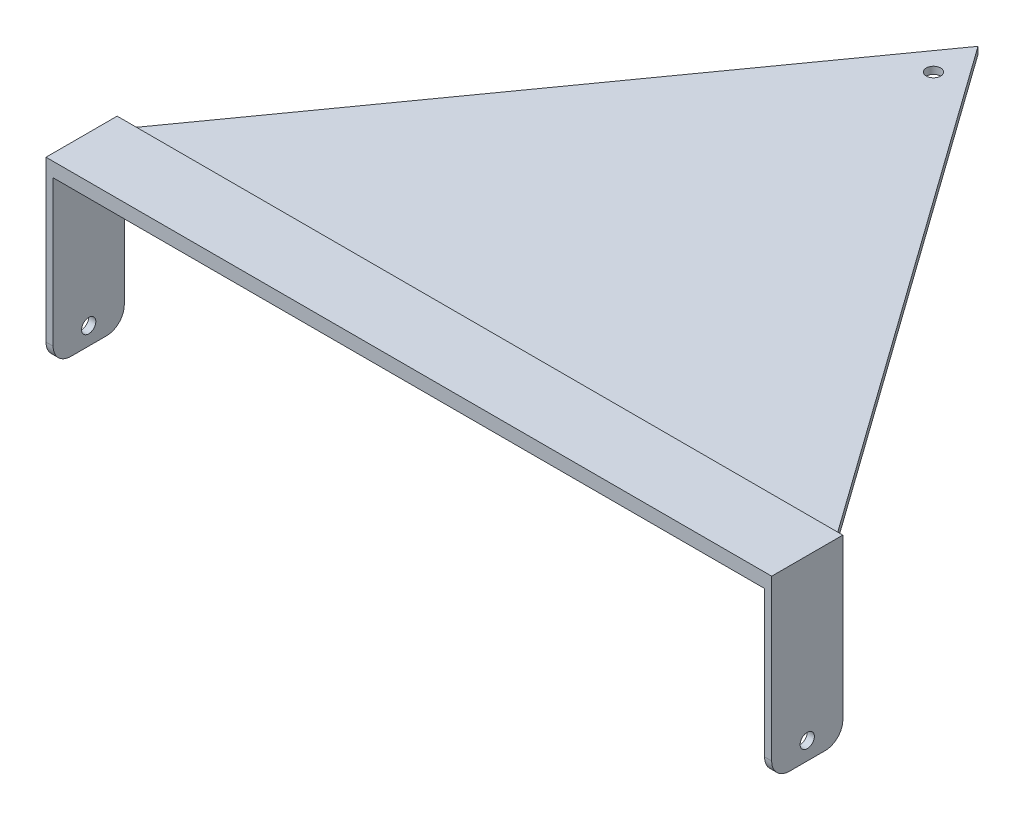
ISO-10303-21;
HEADER;
FILE_DESCRIPTION(('STEP AP214'),'2;1');
FILE_NAME('part.step','',(''),(''),'','','');
FILE_SCHEMA(('AUTOMOTIVE_DESIGN { 1 0 10303 214 1 1 1 1 }'));
ENDSEC;
DATA;
#1=APPLICATION_CONTEXT('core data for automotive mechanical design processes');
#2=APPLICATION_PROTOCOL_DEFINITION('international standard','automotive_design',2000,#1);
#3=PRODUCT_CONTEXT('',#1,'mechanical');
#4=PRODUCT('Part','Part','',(#3));
#5=PRODUCT_RELATED_PRODUCT_CATEGORY('part','',(#4));
#6=PRODUCT_DEFINITION_FORMATION('','',#4);
#7=PRODUCT_DEFINITION_CONTEXT('part definition',#1,'design');
#8=PRODUCT_DEFINITION('design','',#6,#7);
#9=PRODUCT_DEFINITION_SHAPE('','',#8);
#10=(LENGTH_UNIT() NAMED_UNIT(*) SI_UNIT(.MILLI.,.METRE.));
#11=(NAMED_UNIT(*) PLANE_ANGLE_UNIT() SI_UNIT($,.RADIAN.));
#12=(NAMED_UNIT(*) SI_UNIT($,.STERADIAN.) SOLID_ANGLE_UNIT());
#13=UNCERTAINTY_MEASURE_WITH_UNIT(LENGTH_MEASURE(1.E-05),#10,'distance_accuracy_value','');
#14=(GEOMETRIC_REPRESENTATION_CONTEXT(3) GLOBAL_UNCERTAINTY_ASSIGNED_CONTEXT((#13)) GLOBAL_UNIT_ASSIGNED_CONTEXT((#10,
#11,#12)) REPRESENTATION_CONTEXT('',''));
#15=CARTESIAN_POINT('',(0.,0.,0.));
#16=DIRECTION('',(0.,0.,1.));
#17=DIRECTION('',(1.,0.,0.));
#18=AXIS2_PLACEMENT_3D('',#15,#16,#17);
#19=CARTESIAN_POINT('',(0.,2.,0.));
#20=DIRECTION('',(0.,1.,0.));
#21=DIRECTION('',(0.,0.,1.));
#22=AXIS2_PLACEMENT_3D('',#19,#20,#21);
#23=PLANE('',#22);
#24=CARTESIAN_POINT('',(100.,2.,-137.477270848675));
#25=DIRECTION('',(0.,1.,0.));
#26=DIRECTION('',(0.,0.,1.));
#27=AXIS2_PLACEMENT_3D('',#24,#25,#26);
#28=CIRCLE('',#27,2.);
#29=CARTESIAN_POINT('',(100.,2.,-135.477270848675));
#30=VERTEX_POINT('',#29);
#31=EDGE_CURVE('E218',#30,#30,#28,.T.);
#32=ORIENTED_EDGE('',*,*,#31,.F.);
#33=EDGE_LOOP('',(#32));
#34=FACE_BOUND('',#33,.T.);
#35=DIRECTION('',(-0.581238193719096,0.,0.813733471206735));
#36=VECTOR('',#35,1.);
#37=CARTESIAN_POINT('',(0.,2.,-10.));
#38=LINE('',#37,#36);
#39=CARTESIAN_POINT('',(100.,2.,-150.));
#40=VERTEX_POINT('',#39);
#41=CARTESIAN_POINT('',(0.,2.,-10.));
#42=VERTEX_POINT('',#41);
#43=EDGE_CURVE('E229',#40,#42,#38,.T.);
#44=ORIENTED_EDGE('',*,*,#43,.T.);
#45=DIRECTION('',(1.,0.,0.));
#46=VECTOR('',#45,1.);
#47=CARTESIAN_POINT('',(0.,2.,-10.));
#48=LINE('',#47,#46);
#49=CARTESIAN_POINT('',(200.,2.,-10.));
#50=VERTEX_POINT('',#49);
#51=EDGE_CURVE('E205',#42,#50,#48,.T.);
#52=ORIENTED_EDGE('',*,*,#51,.T.);
#53=DIRECTION('',(-0.581238193719096,0.,-0.813733471206735));
#54=VECTOR('',#53,1.);
#55=CARTESIAN_POINT('',(200.,2.,-10.));
#56=LINE('',#55,#54);
#57=EDGE_CURVE('E226',#50,#40,#56,.T.);
#58=ORIENTED_EDGE('',*,*,#57,.T.);
#59=EDGE_LOOP('',(#44,#52,#58));
#60=FACE_BOUND('',#59,.T.);
#61=ADVANCED_FACE('F39',(#34,#60),#23,.T.);
#62=CARTESIAN_POINT('',(0.,0.,0.));
#63=DIRECTION('',(0.,1.,0.));
#64=DIRECTION('',(0.,0.,1.));
#65=AXIS2_PLACEMENT_3D('',#62,#63,#64);
#66=PLANE('',#65);
#67=DIRECTION('',(0.,0.,1.));
#68=VECTOR('',#67,1.);
#69=CARTESIAN_POINT('',(0.,0.,10.));
#70=LINE('',#69,#68);
#71=CARTESIAN_POINT('',(0.,0.,-10.));
#72=VERTEX_POINT('',#71);
#73=CARTESIAN_POINT('',(0.,0.,10.));
#74=VERTEX_POINT('',#73);
#75=EDGE_CURVE('E222',#72,#74,#70,.T.);
#76=ORIENTED_EDGE('',*,*,#75,.F.);
#77=DIRECTION('',(-0.581238193719096,0.,0.813733471206735));
#78=VECTOR('',#77,1.);
#79=CARTESIAN_POINT('',(0.,0.,-10.));
#80=LINE('',#79,#78);
#81=CARTESIAN_POINT('',(100.,0.,-150.));
#82=VERTEX_POINT('',#81);
#83=EDGE_CURVE('E230',#82,#72,#80,.T.);
#84=ORIENTED_EDGE('',*,*,#83,.F.);
#85=DIRECTION('',(-0.581238193719096,0.,-0.813733471206735));
#86=VECTOR('',#85,1.);
#87=CARTESIAN_POINT('',(200.,0.,-10.));
#88=LINE('',#87,#86);
#89=CARTESIAN_POINT('',(200.,0.,-10.));
#90=VERTEX_POINT('',#89);
#91=EDGE_CURVE('E246',#90,#82,#88,.T.);
#92=ORIENTED_EDGE('',*,*,#91,.F.);
#93=DIRECTION('',(0.,0.,-1.));
#94=VECTOR('',#93,1.);
#95=CARTESIAN_POINT('',(200.,0.,0.));
#96=LINE('',#95,#94);
#97=CARTESIAN_POINT('',(200.,0.,10.));
#98=VERTEX_POINT('',#97);
#99=EDGE_CURVE('E242',#98,#90,#96,.T.);
#100=ORIENTED_EDGE('',*,*,#99,.F.);
#101=DIRECTION('',(1.,0.,0.));
#102=VECTOR('',#101,1.);
#103=CARTESIAN_POINT('',(200.,0.,10.));
#104=LINE('',#103,#102);
#105=EDGE_CURVE('E238',#74,#98,#104,.T.);
#106=ORIENTED_EDGE('',*,*,#105,.F.);
#107=EDGE_LOOP('',(#76,#84,#92,#100,#106));
#108=FACE_BOUND('',#107,.T.);
#109=CARTESIAN_POINT('',(100.,0.,-137.477270848675));
#110=DIRECTION('',(0.,1.,0.));
#111=DIRECTION('',(0.,0.,1.));
#112=AXIS2_PLACEMENT_3D('',#109,#110,#111);
#113=CIRCLE('',#112,2.);
#114=CARTESIAN_POINT('',(100.,0.,-135.477270848675));
#115=VERTEX_POINT('',#114);
#116=EDGE_CURVE('E165',#115,#115,#113,.T.);
#117=ORIENTED_EDGE('',*,*,#116,.T.);
#118=EDGE_LOOP('',(#117));
#119=FACE_BOUND('',#118,.T.);
#120=ADVANCED_FACE('F329',(#108,#119),#66,.F.);
#121=CARTESIAN_POINT('',(200.,2.,10.));
#122=DIRECTION('',(0.,0.,-1.));
#123=DIRECTION('',(-1.,0.,0.));
#124=AXIS2_PLACEMENT_3D('',#121,#122,#123);
#125=PLANE('',#124);
#126=DIRECTION('',(0.,1.,0.));
#127=VECTOR('',#126,1.);
#128=CARTESIAN_POINT('',(200.,-46.,9.99999999999999));
#129=LINE('',#128,#127);
#130=CARTESIAN_POINT('',(200.,-41.,9.99999999999999));
#131=VERTEX_POINT('',#130);
#132=EDGE_CURVE('E155',#131,#98,#129,.T.);
#133=ORIENTED_EDGE('',*,*,#132,.F.);
#134=DIRECTION('',(1.,0.,0.));
#135=VECTOR('',#134,1.);
#136=CARTESIAN_POINT('',(200.,-41.,10.));
#137=LINE('',#136,#135);
#138=CARTESIAN_POINT('',(202.,-41.,9.99999999999999));
#139=VERTEX_POINT('',#138);
#140=EDGE_CURVE('E150',#131,#139,#137,.T.);
#141=ORIENTED_EDGE('',*,*,#140,.T.);
#142=DIRECTION('',(0.,1.,0.));
#143=VECTOR('',#142,1.);
#144=CARTESIAN_POINT('',(202.,-46.,9.99999999999999));
#145=LINE('',#144,#143);
#146=CARTESIAN_POINT('',(202.,4.,9.99999999999999));
#147=VERTEX_POINT('',#146);
#148=EDGE_CURVE('E142',#139,#147,#145,.T.);
#149=ORIENTED_EDGE('',*,*,#148,.T.);
#150=DIRECTION('',(1.,0.,0.));
#151=VECTOR('',#150,1.);
#152=CARTESIAN_POINT('',(0.,4.,10.));
#153=LINE('',#152,#151);
#154=CARTESIAN_POINT('',(-2.,4.,10.));
#155=VERTEX_POINT('',#154);
#156=EDGE_CURVE('E147',#155,#147,#153,.T.);
#157=ORIENTED_EDGE('',*,*,#156,.F.);
#158=DIRECTION('',(0.,1.,0.));
#159=VECTOR('',#158,1.);
#160=CARTESIAN_POINT('',(-2.,-46.,10.));
#161=LINE('',#160,#159);
#162=CARTESIAN_POINT('',(-2.,-41.,10.));
#163=VERTEX_POINT('',#162);
#164=EDGE_CURVE('E206',#163,#155,#161,.T.);
#165=ORIENTED_EDGE('',*,*,#164,.F.);
#166=DIRECTION('',(1.,0.,0.));
#167=VECTOR('',#166,1.);
#168=CARTESIAN_POINT('',(0.,-41.,10.));
#169=LINE('',#168,#167);
#170=CARTESIAN_POINT('',(0.,-41.,10.));
#171=VERTEX_POINT('',#170);
#172=EDGE_CURVE('E263',#163,#171,#169,.T.);
#173=ORIENTED_EDGE('',*,*,#172,.T.);
#174=DIRECTION('',(0.,1.,0.));
#175=VECTOR('',#174,1.);
#176=CARTESIAN_POINT('',(0.,-46.,10.));
#177=LINE('',#176,#175);
#178=EDGE_CURVE('E202',#171,#74,#177,.T.);
#179=ORIENTED_EDGE('',*,*,#178,.T.);
#180=ORIENTED_EDGE('',*,*,#105,.T.);
#181=EDGE_LOOP('',(#133,#141,#149,#157,#165,#173,#179,#180));
#182=FACE_BOUND('',#181,.T.);
#183=ADVANCED_FACE('F145',(#182),#125,.F.);
#184=CARTESIAN_POINT('',(200.,2.,-10.));
#185=DIRECTION('',(-0.813733471206735,0.,0.581238193719096));
#186=DIRECTION('',(0.581238193719096,0.,0.813733471206735));
#187=AXIS2_PLACEMENT_3D('',#184,#185,#186);
#188=PLANE('',#187);
#189=ORIENTED_EDGE('',*,*,#91,.T.);
#190=DIRECTION('',(0.,-1.,0.));
#191=VECTOR('',#190,1.);
#192=CARTESIAN_POINT('',(100.,2.,-150.));
#193=LINE('',#192,#191);
#194=EDGE_CURVE('E255',#40,#82,#193,.T.);
#195=ORIENTED_EDGE('',*,*,#194,.F.);
#196=ORIENTED_EDGE('',*,*,#57,.F.);
#197=DIRECTION('',(0.,-1.,0.));
#198=VECTOR('',#197,1.);
#199=CARTESIAN_POINT('',(200.,2.,-10.));
#200=LINE('',#199,#198);
#201=EDGE_CURVE('E259',#50,#90,#200,.T.);
#202=ORIENTED_EDGE('',*,*,#201,.T.);
#203=EDGE_LOOP('',(#189,#195,#196,#202));
#204=FACE_BOUND('',#203,.T.);
#205=ADVANCED_FACE('F344',(#204),#188,.F.);
#206=CARTESIAN_POINT('',(0.,2.,-10.));
#207=DIRECTION('',(0.813733471206735,0.,0.581238193719096));
#208=DIRECTION('',(0.581238193719096,0.,-0.813733471206735));
#209=AXIS2_PLACEMENT_3D('',#206,#207,#208);
#210=PLANE('',#209);
#211=ORIENTED_EDGE('',*,*,#83,.T.);
#212=DIRECTION('',(0.,-1.,0.));
#213=VECTOR('',#212,1.);
#214=CARTESIAN_POINT('',(0.,2.,-10.));
#215=LINE('',#214,#213);
#216=EDGE_CURVE('E234',#42,#72,#215,.T.);
#217=ORIENTED_EDGE('',*,*,#216,.F.);
#218=ORIENTED_EDGE('',*,*,#43,.F.);
#219=ORIENTED_EDGE('',*,*,#194,.T.);
#220=EDGE_LOOP('',(#211,#217,#218,#219));
#221=FACE_BOUND('',#220,.T.);
#222=ADVANCED_FACE('F337',(#221),#210,.F.);
#223=CARTESIAN_POINT('',(100.,2.,-137.477270848675));
#224=DIRECTION('',(0.,-1.,0.));
#225=DIRECTION('',(0.,0.,-1.));
#226=AXIS2_PLACEMENT_3D('',#223,#224,#225);
#227=CYLINDRICAL_SURFACE('',#226,2.);
#228=ORIENTED_EDGE('',*,*,#31,.T.);
#229=EDGE_LOOP('',(#228));
#230=FACE_BOUND('',#229,.T.);
#231=ORIENTED_EDGE('',*,*,#116,.F.);
#232=EDGE_LOOP('',(#231));
#233=FACE_BOUND('',#232,.T.);
#234=ADVANCED_FACE('F351',(#230,#233),#227,.F.);
#235=CARTESIAN_POINT('',(0.,4.,-10.));
#236=DIRECTION('',(0.,0.,-1.));
#237=DIRECTION('',(-1.,0.,0.));
#238=AXIS2_PLACEMENT_3D('',#235,#236,#237);
#239=PLANE('',#238);
#240=DIRECTION('',(0.,1.,0.));
#241=VECTOR('',#240,1.);
#242=CARTESIAN_POINT('',(202.,-46.,-10.));
#243=LINE('',#242,#241);
#244=CARTESIAN_POINT('',(202.,-41.,-10.));
#245=VERTEX_POINT('',#244);
#246=CARTESIAN_POINT('',(202.,4.,-10.));
#247=VERTEX_POINT('',#246);
#248=EDGE_CURVE('E154',#245,#247,#243,.T.);
#249=ORIENTED_EDGE('',*,*,#248,.F.);
#250=DIRECTION('',(-1.,0.,0.));
#251=VECTOR('',#250,1.);
#252=CARTESIAN_POINT('',(200.,-41.,-10.));
#253=LINE('',#252,#251);
#254=CARTESIAN_POINT('',(200.,-41.,-10.));
#255=VERTEX_POINT('',#254);
#256=EDGE_CURVE('E291',#245,#255,#253,.T.);
#257=ORIENTED_EDGE('',*,*,#256,.T.);
#258=DIRECTION('',(0.,1.,0.));
#259=VECTOR('',#258,1.);
#260=CARTESIAN_POINT('',(200.,-46.,-10.));
#261=LINE('',#260,#259);
#262=EDGE_CURVE('E185',#255,#90,#261,.T.);
#263=ORIENTED_EDGE('',*,*,#262,.T.);
#264=ORIENTED_EDGE('',*,*,#201,.F.);
#265=ORIENTED_EDGE('',*,*,#51,.F.);
#266=ORIENTED_EDGE('',*,*,#216,.T.);
#267=DIRECTION('',(0.,1.,0.));
#268=VECTOR('',#267,1.);
#269=CARTESIAN_POINT('',(0.,-46.,-10.));
#270=LINE('',#269,#268);
#271=CARTESIAN_POINT('',(0.,-41.,-10.));
#272=VERTEX_POINT('',#271);
#273=EDGE_CURVE('E199',#272,#72,#270,.T.);
#274=ORIENTED_EDGE('',*,*,#273,.F.);
#275=DIRECTION('',(-1.,0.,0.));
#276=VECTOR('',#275,1.);
#277=CARTESIAN_POINT('',(0.,-41.,-10.));
#278=LINE('',#277,#276);
#279=CARTESIAN_POINT('',(-2.,-41.,-10.));
#280=VERTEX_POINT('',#279);
#281=EDGE_CURVE('E287',#272,#280,#278,.T.);
#282=ORIENTED_EDGE('',*,*,#281,.T.);
#283=DIRECTION('',(0.,1.,0.));
#284=VECTOR('',#283,1.);
#285=CARTESIAN_POINT('',(-2.,-46.,-10.));
#286=LINE('',#285,#284);
#287=CARTESIAN_POINT('',(-2.,4.,-10.));
#288=VERTEX_POINT('',#287);
#289=EDGE_CURVE('E209',#280,#288,#286,.T.);
#290=ORIENTED_EDGE('',*,*,#289,.T.);
#291=DIRECTION('',(1.,0.,0.));
#292=VECTOR('',#291,1.);
#293=CARTESIAN_POINT('',(0.,4.,-10.));
#294=LINE('',#293,#292);
#295=EDGE_CURVE('E166',#288,#247,#294,.T.);
#296=ORIENTED_EDGE('',*,*,#295,.T.);
#297=EDGE_LOOP('',(#249,#257,#263,#264,#265,#266,#274,#282,#290,#296));
#298=FACE_BOUND('',#297,.T.);
#299=ADVANCED_FACE('F319',(#298),#239,.T.);
#300=CARTESIAN_POINT('',(0.,4.,0.));
#301=DIRECTION('',(0.,1.,0.));
#302=DIRECTION('',(0.,0.,1.));
#303=AXIS2_PLACEMENT_3D('',#300,#301,#302);
#304=PLANE('',#303);
#305=ORIENTED_EDGE('',*,*,#295,.F.);
#306=DIRECTION('',(0.,0.,1.));
#307=VECTOR('',#306,1.);
#308=CARTESIAN_POINT('',(-2.,4.,-10.));
#309=LINE('',#308,#307);
#310=EDGE_CURVE('E163',#288,#155,#309,.T.);
#311=ORIENTED_EDGE('',*,*,#310,.T.);
#312=ORIENTED_EDGE('',*,*,#156,.T.);
#313=DIRECTION('',(0.,0.,-1.));
#314=VECTOR('',#313,1.);
#315=CARTESIAN_POINT('',(202.,4.,-10.));
#316=LINE('',#315,#314);
#317=EDGE_CURVE('E161',#147,#247,#316,.T.);
#318=ORIENTED_EDGE('',*,*,#317,.T.);
#319=EDGE_LOOP('',(#305,#311,#312,#318));
#320=FACE_BOUND('',#319,.T.);
#321=ADVANCED_FACE('F160',(#320),#304,.T.);
#322=CARTESIAN_POINT('',(0.,-46.,-10.));
#323=DIRECTION('',(1.,0.,0.));
#324=DIRECTION('',(0.,0.,-1.));
#325=AXIS2_PLACEMENT_3D('',#322,#323,#324);
#326=PLANE('',#325);
#327=CARTESIAN_POINT('',(0.,-41.,0.));
#328=DIRECTION('',(1.,0.,0.));
#329=DIRECTION('',(0.,0.,-1.));
#330=AXIS2_PLACEMENT_3D('',#327,#328,#329);
#331=CIRCLE('',#330,2.);
#332=CARTESIAN_POINT('',(0.,-41.,-2.));
#333=VERTEX_POINT('',#332);
#334=EDGE_CURVE('E173',#333,#333,#331,.T.);
#335=ORIENTED_EDGE('',*,*,#334,.F.);
#336=EDGE_LOOP('',(#335));
#337=FACE_BOUND('',#336,.T.);
#338=DIRECTION('',(0.,0.,-1.));
#339=VECTOR('',#338,1.);
#340=CARTESIAN_POINT('',(0.,-46.,-10.));
#341=LINE('',#340,#339);
#342=CARTESIAN_POINT('',(0.,-46.,5.00000000000002));
#343=VERTEX_POINT('',#342);
#344=CARTESIAN_POINT('',(0.,-46.,-5.));
#345=VERTEX_POINT('',#344);
#346=EDGE_CURVE('E192',#343,#345,#341,.T.);
#347=ORIENTED_EDGE('',*,*,#346,.T.);
#348=CARTESIAN_POINT('',(0.,-41.,-5.));
#349=DIRECTION('',(1.,0.,0.));
#350=DIRECTION('',(0.,0.,-1.));
#351=AXIS2_PLACEMENT_3D('',#348,#349,#350);
#352=CIRCLE('',#351,5.);
#353=EDGE_CURVE('E11',#345,#272,#352,.T.);
#354=ORIENTED_EDGE('',*,*,#353,.T.);
#355=ORIENTED_EDGE('',*,*,#273,.T.);
#356=ORIENTED_EDGE('',*,*,#75,.T.);
#357=ORIENTED_EDGE('',*,*,#178,.F.);
#358=CARTESIAN_POINT('',(0.,-41.,5.00000000000002));
#359=DIRECTION('',(1.,0.,0.));
#360=DIRECTION('',(0.,0.,-1.));
#361=AXIS2_PLACEMENT_3D('',#358,#359,#360);
#362=CIRCLE('',#361,5.);
#363=EDGE_CURVE('E49',#171,#343,#362,.T.);
#364=ORIENTED_EDGE('',*,*,#363,.T.);
#365=EDGE_LOOP('',(#347,#354,#355,#356,#357,#364));
#366=FACE_BOUND('',#365,.T.);
#367=ADVANCED_FACE('F333',(#337,#366),#326,.T.);
#368=CARTESIAN_POINT('',(-2.,-46.,-10.));
#369=DIRECTION('',(-1.,0.,0.));
#370=DIRECTION('',(0.,0.,1.));
#371=AXIS2_PLACEMENT_3D('',#368,#369,#370);
#372=PLANE('',#371);
#373=CARTESIAN_POINT('',(-2.,-41.,0.));
#374=DIRECTION('',(-1.,0.,0.));
#375=DIRECTION('',(0.,0.,1.));
#376=AXIS2_PLACEMENT_3D('',#373,#374,#375);
#377=CIRCLE('',#376,2.);
#378=CARTESIAN_POINT('',(-2.,-41.,2.));
#379=VERTEX_POINT('',#378);
#380=EDGE_CURVE('E407',#379,#379,#377,.T.);
#381=ORIENTED_EDGE('',*,*,#380,.F.);
#382=EDGE_LOOP('',(#381));
#383=FACE_BOUND('',#382,.T.);
#384=ORIENTED_EDGE('',*,*,#289,.F.);
#385=CARTESIAN_POINT('',(-2.,-41.,-5.));
#386=DIRECTION('',(-1.,0.,0.));
#387=DIRECTION('',(0.,0.,1.));
#388=AXIS2_PLACEMENT_3D('',#385,#386,#387);
#389=CIRCLE('',#388,5.);
#390=CARTESIAN_POINT('',(-2.,-46.,-5.));
#391=VERTEX_POINT('',#390);
#392=EDGE_CURVE('E298',#280,#391,#389,.T.);
#393=ORIENTED_EDGE('',*,*,#392,.T.);
#394=DIRECTION('',(0.,0.,1.));
#395=VECTOR('',#394,1.);
#396=CARTESIAN_POINT('',(-2.,-46.,-10.));
#397=LINE('',#396,#395);
#398=CARTESIAN_POINT('',(-2.,-46.,5.00000000000002));
#399=VERTEX_POINT('',#398);
#400=EDGE_CURVE('E195',#391,#399,#397,.T.);
#401=ORIENTED_EDGE('',*,*,#400,.T.);
#402=CARTESIAN_POINT('',(-2.,-41.,5.00000000000002));
#403=DIRECTION('',(-1.,0.,0.));
#404=DIRECTION('',(0.,0.,1.));
#405=AXIS2_PLACEMENT_3D('',#402,#403,#404);
#406=CIRCLE('',#405,5.);
#407=EDGE_CURVE('E295',#399,#163,#406,.T.);
#408=ORIENTED_EDGE('',*,*,#407,.T.);
#409=ORIENTED_EDGE('',*,*,#164,.T.);
#410=ORIENTED_EDGE('',*,*,#310,.F.);
#411=EDGE_LOOP('',(#384,#393,#401,#408,#409,#410));
#412=FACE_BOUND('',#411,.T.);
#413=ADVANCED_FACE('F372',(#383,#412),#372,.T.);
#414=CARTESIAN_POINT('',(0.,-46.,0.));
#415=DIRECTION('',(0.,-1.,0.));
#416=DIRECTION('',(0.,0.,-1.));
#417=AXIS2_PLACEMENT_3D('',#414,#415,#416);
#418=PLANE('',#417);
#419=ORIENTED_EDGE('',*,*,#400,.F.);
#420=DIRECTION('',(-1.,0.,0.));
#421=VECTOR('',#420,1.);
#422=CARTESIAN_POINT('',(0.,-46.,-5.));
#423=LINE('',#422,#421);
#424=EDGE_CURVE('E56',#391,#345,#423,.F.);
#425=ORIENTED_EDGE('',*,*,#424,.T.);
#426=ORIENTED_EDGE('',*,*,#346,.F.);
#427=DIRECTION('',(1.,0.,0.));
#428=VECTOR('',#427,1.);
#429=CARTESIAN_POINT('',(-2.,-46.,5.00000000000002));
#430=LINE('',#429,#428);
#431=EDGE_CURVE('E301',#343,#399,#430,.F.);
#432=ORIENTED_EDGE('',*,*,#431,.T.);
#433=EDGE_LOOP('',(#419,#425,#426,#432));
#434=FACE_BOUND('',#433,.T.);
#435=ADVANCED_FACE('F376',(#434),#418,.T.);
#436=CARTESIAN_POINT('',(200.,-46.,-10.));
#437=DIRECTION('',(-1.,0.,0.));
#438=DIRECTION('',(0.,0.,1.));
#439=AXIS2_PLACEMENT_3D('',#436,#437,#438);
#440=PLANE('',#439);
#441=CARTESIAN_POINT('',(200.,-41.,0.));
#442=DIRECTION('',(-1.,0.,0.));
#443=DIRECTION('',(0.,0.,1.));
#444=AXIS2_PLACEMENT_3D('',#441,#442,#443);
#445=CIRCLE('',#444,2.);
#446=CARTESIAN_POINT('',(200.,-41.,1.99999999999997));
#447=VERTEX_POINT('',#446);
#448=EDGE_CURVE('E181',#447,#447,#445,.T.);
#449=ORIENTED_EDGE('',*,*,#448,.F.);
#450=EDGE_LOOP('',(#449));
#451=FACE_BOUND('',#450,.T.);
#452=DIRECTION('',(0.,0.,1.));
#453=VECTOR('',#452,1.);
#454=CARTESIAN_POINT('',(200.,-46.,-10.));
#455=LINE('',#454,#453);
#456=CARTESIAN_POINT('',(200.,-46.,-5.));
#457=VERTEX_POINT('',#456);
#458=CARTESIAN_POINT('',(200.,-46.,5.));
#459=VERTEX_POINT('',#458);
#460=EDGE_CURVE('E172',#457,#459,#455,.T.);
#461=ORIENTED_EDGE('',*,*,#460,.T.);
#462=CARTESIAN_POINT('',(200.,-41.,5.));
#463=DIRECTION('',(-1.,0.,0.));
#464=DIRECTION('',(0.,0.,1.));
#465=AXIS2_PLACEMENT_3D('',#462,#463,#464);
#466=CIRCLE('',#465,5.);
#467=EDGE_CURVE('E284',#459,#131,#466,.T.);
#468=ORIENTED_EDGE('',*,*,#467,.T.);
#469=ORIENTED_EDGE('',*,*,#132,.T.);
#470=ORIENTED_EDGE('',*,*,#99,.T.);
#471=ORIENTED_EDGE('',*,*,#262,.F.);
#472=CARTESIAN_POINT('',(200.,-41.,-5.));
#473=DIRECTION('',(-1.,0.,0.));
#474=DIRECTION('',(0.,0.,1.));
#475=AXIS2_PLACEMENT_3D('',#472,#473,#474);
#476=CIRCLE('',#475,5.);
#477=EDGE_CURVE('E281',#255,#457,#476,.T.);
#478=ORIENTED_EDGE('',*,*,#477,.T.);
#479=EDGE_LOOP('',(#461,#468,#469,#470,#471,#478));
#480=FACE_BOUND('',#479,.T.);
#481=ADVANCED_FACE('F323',(#451,#480),#440,.T.);
#482=CARTESIAN_POINT('',(202.,-46.,-10.));
#483=DIRECTION('',(1.,0.,0.));
#484=DIRECTION('',(0.,0.,-1.));
#485=AXIS2_PLACEMENT_3D('',#482,#483,#484);
#486=PLANE('',#485);
#487=CARTESIAN_POINT('',(202.,-41.,0.));
#488=DIRECTION('',(1.,0.,0.));
#489=DIRECTION('',(0.,0.,-1.));
#490=AXIS2_PLACEMENT_3D('',#487,#488,#489);
#491=CIRCLE('',#490,2.);
#492=CARTESIAN_POINT('',(202.,-41.,-2.00000000000003));
#493=VERTEX_POINT('',#492);
#494=EDGE_CURVE('E43',#493,#493,#491,.T.);
#495=ORIENTED_EDGE('',*,*,#494,.F.);
#496=EDGE_LOOP('',(#495));
#497=FACE_BOUND('',#496,.T.);
#498=ORIENTED_EDGE('',*,*,#148,.F.);
#499=CARTESIAN_POINT('',(202.,-41.,5.));
#500=DIRECTION('',(1.,0.,0.));
#501=DIRECTION('',(0.,0.,-1.));
#502=AXIS2_PLACEMENT_3D('',#499,#500,#501);
#503=CIRCLE('',#502,5.);
#504=CARTESIAN_POINT('',(202.,-46.,5.));
#505=VERTEX_POINT('',#504);
#506=EDGE_CURVE('E272',#139,#505,#503,.T.);
#507=ORIENTED_EDGE('',*,*,#506,.T.);
#508=DIRECTION('',(0.,0.,-1.));
#509=VECTOR('',#508,1.);
#510=CARTESIAN_POINT('',(202.,-46.,-10.));
#511=LINE('',#510,#509);
#512=CARTESIAN_POINT('',(202.,-46.,-5.));
#513=VERTEX_POINT('',#512);
#514=EDGE_CURVE('E178',#505,#513,#511,.T.);
#515=ORIENTED_EDGE('',*,*,#514,.T.);
#516=CARTESIAN_POINT('',(202.,-41.,-5.));
#517=DIRECTION('',(1.,0.,0.));
#518=DIRECTION('',(0.,0.,-1.));
#519=AXIS2_PLACEMENT_3D('',#516,#517,#518);
#520=CIRCLE('',#519,5.);
#521=EDGE_CURVE('E269',#513,#245,#520,.T.);
#522=ORIENTED_EDGE('',*,*,#521,.T.);
#523=ORIENTED_EDGE('',*,*,#248,.T.);
#524=ORIENTED_EDGE('',*,*,#317,.F.);
#525=EDGE_LOOP('',(#498,#507,#515,#522,#523,#524));
#526=FACE_BOUND('',#525,.T.);
#527=ADVANCED_FACE('F168',(#497,#526),#486,.T.);
#528=CARTESIAN_POINT('',(0.,-46.,0.));
#529=DIRECTION('',(0.,1.,0.));
#530=DIRECTION('',(0.,0.,1.));
#531=AXIS2_PLACEMENT_3D('',#528,#529,#530);
#532=PLANE('',#531);
#533=ORIENTED_EDGE('',*,*,#514,.F.);
#534=DIRECTION('',(1.,0.,0.));
#535=VECTOR('',#534,1.);
#536=CARTESIAN_POINT('',(0.,-46.,5.00000000000002));
#537=LINE('',#536,#535);
#538=EDGE_CURVE('E278',#505,#459,#537,.F.);
#539=ORIENTED_EDGE('',*,*,#538,.T.);
#540=ORIENTED_EDGE('',*,*,#460,.F.);
#541=DIRECTION('',(-1.,0.,0.));
#542=VECTOR('',#541,1.);
#543=CARTESIAN_POINT('',(202.,-46.,-5.));
#544=LINE('',#543,#542);
#545=EDGE_CURVE('E275',#457,#513,#544,.F.);
#546=ORIENTED_EDGE('',*,*,#545,.T.);
#547=EDGE_LOOP('',(#533,#539,#540,#546));
#548=FACE_BOUND('',#547,.T.);
#549=ADVANCED_FACE('F385',(#548),#532,.F.);
#550=CARTESIAN_POINT('',(200.,-41.,5.));
#551=DIRECTION('',(1.,0.,0.));
#552=DIRECTION('',(0.,0.,-1.));
#553=AXIS2_PLACEMENT_3D('',#550,#551,#552);
#554=CYLINDRICAL_SURFACE('',#553,5.);
#555=ORIENTED_EDGE('',*,*,#467,.F.);
#556=ORIENTED_EDGE('',*,*,#538,.F.);
#557=ORIENTED_EDGE('',*,*,#506,.F.);
#558=ORIENTED_EDGE('',*,*,#140,.F.);
#559=EDGE_LOOP('',(#555,#556,#557,#558));
#560=FACE_BOUND('',#559,.T.);
#561=ADVANCED_FACE('F389',(#560),#554,.T.);
#562=CARTESIAN_POINT('',(0.,-41.,-5.));
#563=DIRECTION('',(1.,0.,0.));
#564=DIRECTION('',(0.,0.,-1.));
#565=AXIS2_PLACEMENT_3D('',#562,#563,#564);
#566=CYLINDRICAL_SURFACE('',#565,5.);
#567=ORIENTED_EDGE('',*,*,#521,.F.);
#568=ORIENTED_EDGE('',*,*,#545,.F.);
#569=ORIENTED_EDGE('',*,*,#477,.F.);
#570=ORIENTED_EDGE('',*,*,#256,.F.);
#571=EDGE_LOOP('',(#567,#568,#569,#570));
#572=FACE_BOUND('',#571,.T.);
#573=ADVANCED_FACE('F316',(#572),#566,.T.);
#574=CARTESIAN_POINT('',(0.,-41.,-5.));
#575=DIRECTION('',(-1.,0.,0.));
#576=DIRECTION('',(0.,0.,1.));
#577=AXIS2_PLACEMENT_3D('',#574,#575,#576);
#578=CYLINDRICAL_SURFACE('',#577,5.);
#579=ORIENTED_EDGE('',*,*,#353,.F.);
#580=ORIENTED_EDGE('',*,*,#424,.F.);
#581=ORIENTED_EDGE('',*,*,#392,.F.);
#582=ORIENTED_EDGE('',*,*,#281,.F.);
#583=EDGE_LOOP('',(#579,#580,#581,#582));
#584=FACE_BOUND('',#583,.T.);
#585=ADVANCED_FACE('F399',(#584),#578,.T.);
#586=CARTESIAN_POINT('',(200.,-41.,5.));
#587=DIRECTION('',(-1.,0.,0.));
#588=DIRECTION('',(0.,0.,1.));
#589=AXIS2_PLACEMENT_3D('',#586,#587,#588);
#590=CYLINDRICAL_SURFACE('',#589,5.);
#591=ORIENTED_EDGE('',*,*,#407,.F.);
#592=ORIENTED_EDGE('',*,*,#431,.F.);
#593=ORIENTED_EDGE('',*,*,#363,.F.);
#594=ORIENTED_EDGE('',*,*,#172,.F.);
#595=EDGE_LOOP('',(#591,#592,#593,#594));
#596=FACE_BOUND('',#595,.T.);
#597=ADVANCED_FACE('F41',(#596),#590,.T.);
#598=CARTESIAN_POINT('',(248.,-41.,0.));
#599=DIRECTION('',(-1.,0.,0.));
#600=DIRECTION('',(0.,0.,1.));
#601=AXIS2_PLACEMENT_3D('',#598,#599,#600);
#602=CYLINDRICAL_SURFACE('',#601,2.);
#603=ORIENTED_EDGE('',*,*,#448,.T.);
#604=EDGE_LOOP('',(#603));
#605=FACE_BOUND('',#604,.T.);
#606=ORIENTED_EDGE('',*,*,#494,.T.);
#607=EDGE_LOOP('',(#606));
#608=FACE_BOUND('',#607,.T.);
#609=ADVANCED_FACE('F390',(#605,#608),#602,.F.);
#610=ORIENTED_EDGE('',*,*,#334,.T.);
#611=EDGE_LOOP('',(#610));
#612=FACE_BOUND('',#611,.T.);
#613=ORIENTED_EDGE('',*,*,#380,.T.);
#614=EDGE_LOOP('',(#613));
#615=FACE_BOUND('',#614,.T.);
#616=ADVANCED_FACE('F392',(#612,#615),#602,.F.);
#617=CLOSED_SHELL('',(#61,#120,#183,#205,#222,#234,#299,#321,#367,#413,#435,#481,#527,#549,#561,
#573,#585,#597,#609,#616));
#618=MANIFOLD_SOLID_BREP('B2',#617);
#619=ADVANCED_BREP_SHAPE_REPRESENTATION('',(#18,#618),#14);
#620=SHAPE_DEFINITION_REPRESENTATION(#9,#619);
ENDSEC;
END-ISO-10303-21;
